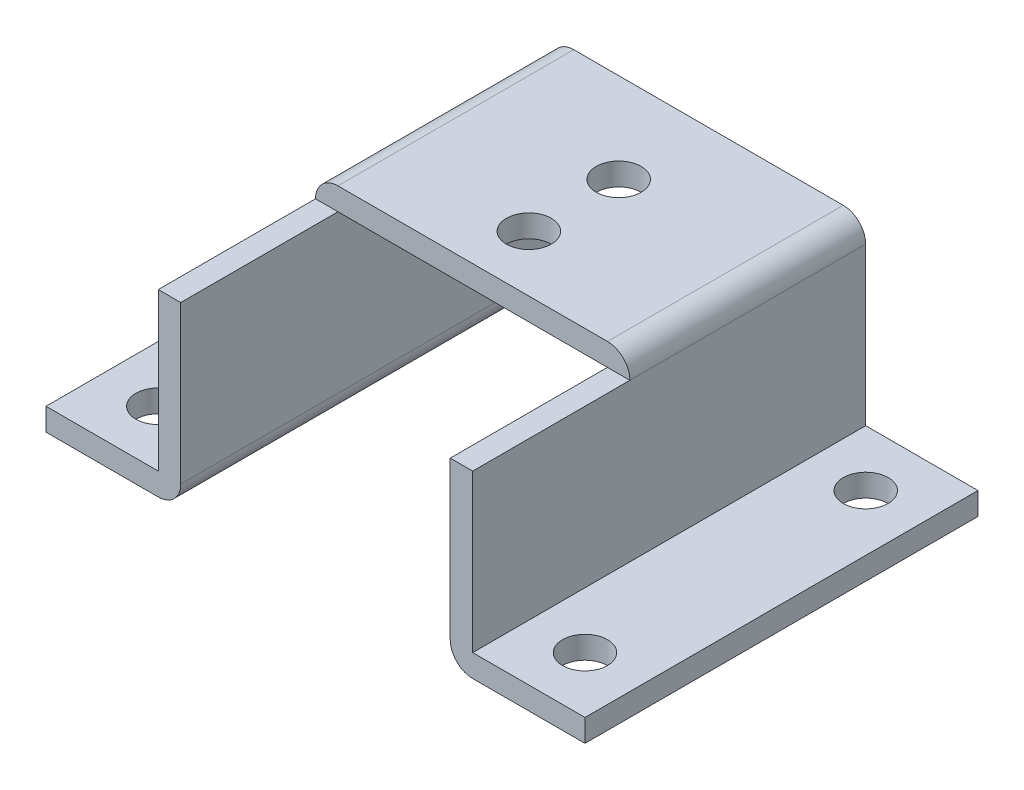
ISO-10303-21;
HEADER;
FILE_DESCRIPTION(('STEP AP214'),'2;1');
FILE_NAME('part.step','',(''),(''),'','','');
FILE_SCHEMA(('AUTOMOTIVE_DESIGN { 1 0 10303 214 1 1 1 1 }'));
ENDSEC;
DATA;
#1=APPLICATION_CONTEXT('core data for automotive mechanical design processes');
#2=APPLICATION_PROTOCOL_DEFINITION('international standard','automotive_design',2000,#1);
#3=PRODUCT_CONTEXT('',#1,'mechanical');
#4=PRODUCT('Part','Part','',(#3));
#5=PRODUCT_RELATED_PRODUCT_CATEGORY('part','',(#4));
#6=PRODUCT_DEFINITION_FORMATION('','',#4);
#7=PRODUCT_DEFINITION_CONTEXT('part definition',#1,'design');
#8=PRODUCT_DEFINITION('design','',#6,#7);
#9=PRODUCT_DEFINITION_SHAPE('','',#8);
#10=(LENGTH_UNIT() NAMED_UNIT(*) SI_UNIT(.MILLI.,.METRE.));
#11=(NAMED_UNIT(*) PLANE_ANGLE_UNIT() SI_UNIT($,.RADIAN.));
#12=(NAMED_UNIT(*) SI_UNIT($,.STERADIAN.) SOLID_ANGLE_UNIT());
#13=UNCERTAINTY_MEASURE_WITH_UNIT(LENGTH_MEASURE(1.E-05),#10,'distance_accuracy_value','');
#14=(GEOMETRIC_REPRESENTATION_CONTEXT(3) GLOBAL_UNCERTAINTY_ASSIGNED_CONTEXT((#13)) GLOBAL_UNIT_ASSIGNED_CONTEXT((#10,
#11,#12)) REPRESENTATION_CONTEXT('',''));
#15=CARTESIAN_POINT('',(0.,0.,0.));
#16=DIRECTION('',(0.,0.,1.));
#17=DIRECTION('',(1.,0.,0.));
#18=AXIS2_PLACEMENT_3D('',#15,#16,#17);
#19=CARTESIAN_POINT('',(12.,-12.8250209588798,-35.));
#20=DIRECTION('',(0.,-1.,0.));
#21=DIRECTION('',(0.,0.,-1.));
#22=AXIS2_PLACEMENT_3D('',#19,#20,#21);
#23=PLANE('',#22);
#24=CARTESIAN_POINT('',(19.,-12.8250209588798,-30.));
#25=DIRECTION('',(0.,1.,0.));
#26=DIRECTION('',(0.,0.,1.));
#27=AXIS2_PLACEMENT_3D('',#24,#25,#26);
#28=CIRCLE('',#27,1.99999999999999);
#29=CARTESIAN_POINT('',(19.,-12.8250209588798,-28.));
#30=VERTEX_POINT('',#29);
#31=EDGE_CURVE('E273',#30,#30,#28,.T.);
#32=ORIENTED_EDGE('',*,*,#31,.T.);
#33=EDGE_LOOP('',(#32));
#34=FACE_BOUND('',#33,.T.);
#35=DIRECTION('',(1.,0.,0.));
#36=VECTOR('',#35,1.);
#37=CARTESIAN_POINT('',(12.,-12.8250209588798,0.));
#38=LINE('',#37,#36);
#39=CARTESIAN_POINT('',(14.,-12.8250209588798,0.));
#40=VERTEX_POINT('',#39);
#41=CARTESIAN_POINT('',(24.,-12.8250209588798,0.));
#42=VERTEX_POINT('',#41);
#43=EDGE_CURVE('E311',#40,#42,#38,.T.);
#44=ORIENTED_EDGE('',*,*,#43,.F.);
#45=DIRECTION('',(0.,0.,1.));
#46=VECTOR('',#45,1.);
#47=CARTESIAN_POINT('',(14.,-12.8250209588798,-35.));
#48=LINE('',#47,#46);
#49=CARTESIAN_POINT('',(14.,-12.8250209588798,-35.));
#50=VERTEX_POINT('',#49);
#51=EDGE_CURVE('E228',#40,#50,#48,.F.);
#52=ORIENTED_EDGE('',*,*,#51,.T.);
#53=DIRECTION('',(1.,0.,0.));
#54=VECTOR('',#53,1.);
#55=CARTESIAN_POINT('',(12.,-12.8250209588798,-35.));
#56=LINE('',#55,#54);
#57=CARTESIAN_POINT('',(24.,-12.8250209588798,-35.));
#58=VERTEX_POINT('',#57);
#59=EDGE_CURVE('E346',#50,#58,#56,.T.);
#60=ORIENTED_EDGE('',*,*,#59,.T.);
#61=DIRECTION('',(0.,0.,1.));
#62=VECTOR('',#61,1.);
#63=CARTESIAN_POINT('',(24.,-12.8250209588798,-35.));
#64=LINE('',#63,#62);
#65=EDGE_CURVE('E383',#58,#42,#64,.T.);
#66=ORIENTED_EDGE('',*,*,#65,.T.);
#67=EDGE_LOOP('',(#44,#52,#60,#66));
#68=FACE_BOUND('',#67,.T.);
#69=CARTESIAN_POINT('',(19.,-12.8250209588798,-5.));
#70=DIRECTION('',(0.,1.,0.));
#71=DIRECTION('',(0.,0.,1.));
#72=AXIS2_PLACEMENT_3D('',#69,#70,#71);
#73=CIRCLE('',#72,1.99999999999999);
#74=CARTESIAN_POINT('',(19.,-12.8250209588798,-3.00000000000001));
#75=VERTEX_POINT('',#74);
#76=EDGE_CURVE('E281',#75,#75,#73,.T.);
#77=ORIENTED_EDGE('',*,*,#76,.T.);
#78=EDGE_LOOP('',(#77));
#79=FACE_BOUND('',#78,.T.);
#80=ADVANCED_FACE('F43',(#34,#68,#79),#23,.T.);
#81=CARTESIAN_POINT('',(0.,0.,0.));
#82=DIRECTION('',(0.,0.,1.));
#83=DIRECTION('',(1.,0.,0.));
#84=AXIS2_PLACEMENT_3D('',#81,#82,#83);
#85=PLANE('',#84);
#86=DIRECTION('',(0.,-1.,0.));
#87=VECTOR('',#86,1.);
#88=CARTESIAN_POINT('',(12.,3.17497904112024,0.));
#89=LINE('',#88,#87);
#90=CARTESIAN_POINT('',(12.,3.17497904112024,0.));
#91=VERTEX_POINT('',#90);
#92=CARTESIAN_POINT('',(12.,-10.8250209588798,0.));
#93=VERTEX_POINT('',#92);
#94=EDGE_CURVE('E377',#91,#93,#89,.T.);
#95=ORIENTED_EDGE('',*,*,#94,.T.);
#96=CARTESIAN_POINT('',(14.,-10.8250209588798,0.));
#97=DIRECTION('',(0.,0.,1.));
#98=DIRECTION('',(1.,0.,0.));
#99=AXIS2_PLACEMENT_3D('',#96,#97,#98);
#100=CIRCLE('',#99,2.);
#101=EDGE_CURVE('E225',#93,#40,#100,.T.);
#102=ORIENTED_EDGE('',*,*,#101,.T.);
#103=ORIENTED_EDGE('',*,*,#43,.T.);
#104=DIRECTION('',(0.,1.,0.));
#105=VECTOR('',#104,1.);
#106=CARTESIAN_POINT('',(24.,-10.8250209588798,0.));
#107=LINE('',#106,#105);
#108=CARTESIAN_POINT('',(24.,-10.8250209588798,0.));
#109=VERTEX_POINT('',#108);
#110=EDGE_CURVE('E305',#42,#109,#107,.T.);
#111=ORIENTED_EDGE('',*,*,#110,.T.);
#112=DIRECTION('',(-1.,0.,0.));
#113=VECTOR('',#112,1.);
#114=CARTESIAN_POINT('',(14.,-10.8250209588798,0.));
#115=LINE('',#114,#113);
#116=CARTESIAN_POINT('',(14.,-10.8250209588798,0.));
#117=VERTEX_POINT('',#116);
#118=EDGE_CURVE('E353',#109,#117,#115,.T.);
#119=ORIENTED_EDGE('',*,*,#118,.T.);
#120=DIRECTION('',(0.,1.,0.));
#121=VECTOR('',#120,1.);
#122=CARTESIAN_POINT('',(14.,5.17497904112024,0.));
#123=LINE('',#122,#121);
#124=CARTESIAN_POINT('',(14.,3.17497904112024,0.));
#125=VERTEX_POINT('',#124);
#126=EDGE_CURVE('E357',#117,#125,#123,.T.);
#127=ORIENTED_EDGE('',*,*,#126,.T.);
#128=DIRECTION('',(1.,0.,0.));
#129=VECTOR('',#128,1.);
#130=CARTESIAN_POINT('',(-14.,3.17497904112024,0.));
#131=LINE('',#130,#129);
#132=EDGE_CURVE('E180',#91,#125,#131,.T.);
#133=ORIENTED_EDGE('',*,*,#132,.F.);
#134=EDGE_LOOP('',(#95,#102,#103,#111,#119,#127,#133));
#135=FACE_BOUND('',#134,.T.);
#136=ADVANCED_FACE('F456',(#135),#85,.T.);
#137=DIRECTION('',(1.,0.,0.));
#138=VECTOR('',#137,1.);
#139=CARTESIAN_POINT('',(-24.,-12.8250209588798,0.));
#140=LINE('',#139,#138);
#141=CARTESIAN_POINT('',(-24.,-12.8250209588798,0.));
#142=VERTEX_POINT('',#141);
#143=CARTESIAN_POINT('',(-14.,-12.8250209588798,0.));
#144=VERTEX_POINT('',#143);
#145=EDGE_CURVE('E371',#142,#144,#140,.T.);
#146=ORIENTED_EDGE('',*,*,#145,.T.);
#147=CARTESIAN_POINT('',(-14.,-10.8250209588798,0.));
#148=DIRECTION('',(0.,0.,1.));
#149=DIRECTION('',(1.,0.,0.));
#150=AXIS2_PLACEMENT_3D('',#147,#148,#149);
#151=CIRCLE('',#150,2.);
#152=CARTESIAN_POINT('',(-12.,-10.8250209588798,0.));
#153=VERTEX_POINT('',#152);
#154=EDGE_CURVE('E68',#144,#153,#151,.T.);
#155=ORIENTED_EDGE('',*,*,#154,.T.);
#156=DIRECTION('',(0.,1.,0.));
#157=VECTOR('',#156,1.);
#158=CARTESIAN_POINT('',(-12.,3.17497904112024,0.));
#159=LINE('',#158,#157);
#160=CARTESIAN_POINT('',(-12.,3.17497904112024,0.));
#161=VERTEX_POINT('',#160);
#162=EDGE_CURVE('E374',#153,#161,#159,.T.);
#163=ORIENTED_EDGE('',*,*,#162,.T.);
#164=CARTESIAN_POINT('',(-14.,3.17497904112024,0.));
#165=VERTEX_POINT('',#164);
#166=EDGE_CURVE('E289',#165,#161,#131,.T.);
#167=ORIENTED_EDGE('',*,*,#166,.F.);
#168=DIRECTION('',(0.,-1.,0.));
#169=VECTOR('',#168,1.);
#170=CARTESIAN_POINT('',(-14.,5.17497904112024,0.));
#171=LINE('',#170,#169);
#172=CARTESIAN_POINT('',(-14.,-10.8250209588798,0.));
#173=VERTEX_POINT('',#172);
#174=EDGE_CURVE('E360',#165,#173,#171,.T.);
#175=ORIENTED_EDGE('',*,*,#174,.T.);
#176=DIRECTION('',(-1.,0.,0.));
#177=VECTOR('',#176,1.);
#178=CARTESIAN_POINT('',(-24.,-10.8250209588798,0.));
#179=LINE('',#178,#177);
#180=CARTESIAN_POINT('',(-24.,-10.8250209588798,0.));
#181=VERTEX_POINT('',#180);
#182=EDGE_CURVE('E363',#173,#181,#179,.T.);
#183=ORIENTED_EDGE('',*,*,#182,.T.);
#184=DIRECTION('',(0.,-1.,0.));
#185=VECTOR('',#184,1.);
#186=CARTESIAN_POINT('',(-24.,-10.8250209588798,0.));
#187=LINE('',#186,#185);
#188=EDGE_CURVE('E367',#181,#142,#187,.T.);
#189=ORIENTED_EDGE('',*,*,#188,.T.);
#190=EDGE_LOOP('',(#146,#155,#163,#167,#175,#183,#189));
#191=FACE_BOUND('',#190,.T.);
#192=ADVANCED_FACE('F477',(#191),#85,.T.);
#193=CARTESIAN_POINT('',(24.,-10.8250209588798,-35.));
#194=DIRECTION('',(1.,0.,0.));
#195=DIRECTION('',(0.,0.,-1.));
#196=AXIS2_PLACEMENT_3D('',#193,#194,#195);
#197=PLANE('',#196);
#198=ORIENTED_EDGE('',*,*,#110,.F.);
#199=ORIENTED_EDGE('',*,*,#65,.F.);
#200=DIRECTION('',(0.,1.,0.));
#201=VECTOR('',#200,1.);
#202=CARTESIAN_POINT('',(24.,-10.8250209588798,-35.));
#203=LINE('',#202,#201);
#204=CARTESIAN_POINT('',(24.,-10.8250209588798,-35.));
#205=VERTEX_POINT('',#204);
#206=EDGE_CURVE('E306',#58,#205,#203,.T.);
#207=ORIENTED_EDGE('',*,*,#206,.T.);
#208=DIRECTION('',(0.,0.,1.));
#209=VECTOR('',#208,1.);
#210=CARTESIAN_POINT('',(24.,-10.8250209588798,-35.));
#211=LINE('',#210,#209);
#212=EDGE_CURVE('E349',#205,#109,#211,.T.);
#213=ORIENTED_EDGE('',*,*,#212,.T.);
#214=EDGE_LOOP('',(#198,#199,#207,#213));
#215=FACE_BOUND('',#214,.T.);
#216=ADVANCED_FACE('F442',(#215),#197,.T.);
#217=CARTESIAN_POINT('',(12.,3.17497904112024,-35.));
#218=DIRECTION('',(-1.,0.,0.));
#219=DIRECTION('',(0.,0.,1.));
#220=AXIS2_PLACEMENT_3D('',#217,#218,#219);
#221=PLANE('',#220);
#222=DIRECTION('',(0.,-1.,0.));
#223=VECTOR('',#222,1.);
#224=CARTESIAN_POINT('',(12.,3.17497904112024,-35.));
#225=LINE('',#224,#223);
#226=CARTESIAN_POINT('',(12.,3.17497904112024,-35.));
#227=VERTEX_POINT('',#226);
#228=CARTESIAN_POINT('',(12.,-10.8250209588798,-35.));
#229=VERTEX_POINT('',#228);
#230=EDGE_CURVE('E342',#227,#229,#225,.T.);
#231=ORIENTED_EDGE('',*,*,#230,.T.);
#232=DIRECTION('',(0.,0.,1.));
#233=VECTOR('',#232,1.);
#234=CARTESIAN_POINT('',(12.,-10.8250209588798,-35.));
#235=LINE('',#234,#233);
#236=EDGE_CURVE('E202',#229,#93,#235,.T.);
#237=ORIENTED_EDGE('',*,*,#236,.T.);
#238=ORIENTED_EDGE('',*,*,#94,.F.);
#239=DIRECTION('',(0.,0.,-1.));
#240=VECTOR('',#239,1.);
#241=CARTESIAN_POINT('',(12.,3.17497904112024,-35.));
#242=LINE('',#241,#240);
#243=CARTESIAN_POINT('',(12.,3.17497904112024,-14.));
#244=VERTEX_POINT('',#243);
#245=EDGE_CURVE('E299',#91,#244,#242,.T.);
#246=ORIENTED_EDGE('',*,*,#245,.T.);
#247=DIRECTION('',(0.,0.,1.));
#248=VECTOR('',#247,1.);
#249=CARTESIAN_POINT('',(12.,3.17497904112024,-35.));
#250=LINE('',#249,#248);
#251=EDGE_CURVE('E388',#227,#244,#250,.T.);
#252=ORIENTED_EDGE('',*,*,#251,.F.);
#253=EDGE_LOOP('',(#231,#237,#238,#246,#252));
#254=FACE_BOUND('',#253,.T.);
#255=ADVANCED_FACE('F454',(#254),#221,.T.);
#256=CARTESIAN_POINT('',(-12.,3.17497904112024,-35.));
#257=DIRECTION('',(0.,-1.,0.));
#258=DIRECTION('',(0.,0.,-1.));
#259=AXIS2_PLACEMENT_3D('',#256,#257,#258);
#260=PLANE('',#259);
#261=CARTESIAN_POINT('',(0.,3.17497904112024,-27.));
#262=DIRECTION('',(0.,-1.,0.));
#263=DIRECTION('',(0.,0.,-1.));
#264=AXIS2_PLACEMENT_3D('',#261,#262,#263);
#265=CIRCLE('',#264,2.);
#266=CARTESIAN_POINT('',(0.,3.17497904112024,-29.));
#267=VERTEX_POINT('',#266);
#268=EDGE_CURVE('E251',#267,#267,#265,.T.);
#269=ORIENTED_EDGE('',*,*,#268,.F.);
#270=EDGE_LOOP('',(#269));
#271=FACE_BOUND('',#270,.T.);
#272=CARTESIAN_POINT('',(0.,3.17497904112024,-19.));
#273=DIRECTION('',(0.,-1.,0.));
#274=DIRECTION('',(0.,0.,-1.));
#275=AXIS2_PLACEMENT_3D('',#272,#273,#274);
#276=CIRCLE('',#275,2.);
#277=CARTESIAN_POINT('',(0.,3.17497904112024,-21.));
#278=VERTEX_POINT('',#277);
#279=EDGE_CURVE('E269',#278,#278,#276,.T.);
#280=ORIENTED_EDGE('',*,*,#279,.F.);
#281=EDGE_LOOP('',(#280));
#282=FACE_BOUND('',#281,.T.);
#283=DIRECTION('',(-1.,0.,0.));
#284=VECTOR('',#283,1.);
#285=CARTESIAN_POINT('',(-14.,3.17497904112024,-14.));
#286=LINE('',#285,#284);
#287=CARTESIAN_POINT('',(-12.,3.17497904112024,-14.));
#288=VERTEX_POINT('',#287);
#289=EDGE_CURVE('E176',#244,#288,#286,.T.);
#290=ORIENTED_EDGE('',*,*,#289,.T.);
#291=DIRECTION('',(0.,0.,1.));
#292=VECTOR('',#291,1.);
#293=CARTESIAN_POINT('',(-12.,3.17497904112024,-35.));
#294=LINE('',#293,#292);
#295=CARTESIAN_POINT('',(-12.,3.17497904112024,-35.));
#296=VERTEX_POINT('',#295);
#297=EDGE_CURVE('E392',#296,#288,#294,.T.);
#298=ORIENTED_EDGE('',*,*,#297,.F.);
#299=DIRECTION('',(1.,0.,0.));
#300=VECTOR('',#299,1.);
#301=CARTESIAN_POINT('',(-12.,3.17497904112024,-35.));
#302=LINE('',#301,#300);
#303=EDGE_CURVE('E338',#296,#227,#302,.T.);
#304=ORIENTED_EDGE('',*,*,#303,.T.);
#305=ORIENTED_EDGE('',*,*,#251,.T.);
#306=EDGE_LOOP('',(#290,#298,#304,#305));
#307=FACE_BOUND('',#306,.T.);
#308=ADVANCED_FACE('F467',(#271,#282,#307),#260,.T.);
#309=CARTESIAN_POINT('',(-12.,3.17497904112024,-35.));
#310=DIRECTION('',(1.,0.,0.));
#311=DIRECTION('',(0.,0.,-1.));
#312=AXIS2_PLACEMENT_3D('',#309,#310,#311);
#313=PLANE('',#312);
#314=ORIENTED_EDGE('',*,*,#162,.F.);
#315=DIRECTION('',(0.,0.,1.));
#316=VECTOR('',#315,1.);
#317=CARTESIAN_POINT('',(-12.,-10.8250209588798,-35.));
#318=LINE('',#317,#316);
#319=CARTESIAN_POINT('',(-12.,-10.8250209588798,-35.));
#320=VERTEX_POINT('',#319);
#321=EDGE_CURVE('E53',#153,#320,#318,.F.);
#322=ORIENTED_EDGE('',*,*,#321,.T.);
#323=DIRECTION('',(0.,1.,0.));
#324=VECTOR('',#323,1.);
#325=CARTESIAN_POINT('',(-12.,3.17497904112024,-35.));
#326=LINE('',#325,#324);
#327=EDGE_CURVE('E335',#320,#296,#326,.T.);
#328=ORIENTED_EDGE('',*,*,#327,.T.);
#329=ORIENTED_EDGE('',*,*,#297,.T.);
#330=DIRECTION('',(0.,0.,1.));
#331=VECTOR('',#330,1.);
#332=CARTESIAN_POINT('',(-12.,3.17497904112024,-35.));
#333=LINE('',#332,#331);
#334=EDGE_CURVE('E293',#288,#161,#333,.T.);
#335=ORIENTED_EDGE('',*,*,#334,.T.);
#336=EDGE_LOOP('',(#314,#322,#328,#329,#335));
#337=FACE_BOUND('',#336,.T.);
#338=ADVANCED_FACE('F469',(#337),#313,.T.);
#339=CARTESIAN_POINT('',(-24.,-12.8250209588798,-35.));
#340=DIRECTION('',(0.,-1.,0.));
#341=DIRECTION('',(0.,0.,-1.));
#342=AXIS2_PLACEMENT_3D('',#339,#340,#341);
#343=PLANE('',#342);
#344=CARTESIAN_POINT('',(-19.,-12.8250209588798,-30.));
#345=DIRECTION('',(0.,1.,0.));
#346=DIRECTION('',(0.,0.,1.));
#347=AXIS2_PLACEMENT_3D('',#344,#345,#346);
#348=CIRCLE('',#347,1.99999999999999);
#349=CARTESIAN_POINT('',(-19.,-12.8250209588798,-28.));
#350=VERTEX_POINT('',#349);
#351=EDGE_CURVE('E259',#350,#350,#348,.T.);
#352=ORIENTED_EDGE('',*,*,#351,.T.);
#353=EDGE_LOOP('',(#352));
#354=FACE_BOUND('',#353,.T.);
#355=CARTESIAN_POINT('',(-19.,-12.8250209588798,-5.));
#356=DIRECTION('',(0.,1.,0.));
#357=DIRECTION('',(0.,0.,1.));
#358=AXIS2_PLACEMENT_3D('',#355,#356,#357);
#359=CIRCLE('',#358,1.99999999999999);
#360=CARTESIAN_POINT('',(-19.,-12.8250209588798,-3.00000000000001));
#361=VERTEX_POINT('',#360);
#362=EDGE_CURVE('E245',#361,#361,#359,.T.);
#363=ORIENTED_EDGE('',*,*,#362,.T.);
#364=EDGE_LOOP('',(#363));
#365=FACE_BOUND('',#364,.T.);
#366=DIRECTION('',(1.,0.,0.));
#367=VECTOR('',#366,1.);
#368=CARTESIAN_POINT('',(-24.,-12.8250209588798,-35.));
#369=LINE('',#368,#367);
#370=CARTESIAN_POINT('',(-24.,-12.8250209588798,-35.));
#371=VERTEX_POINT('',#370);
#372=CARTESIAN_POINT('',(-14.,-12.8250209588798,-35.));
#373=VERTEX_POINT('',#372);
#374=EDGE_CURVE('E331',#371,#373,#369,.T.);
#375=ORIENTED_EDGE('',*,*,#374,.T.);
#376=DIRECTION('',(0.,0.,1.));
#377=VECTOR('',#376,1.);
#378=CARTESIAN_POINT('',(-14.,-12.8250209588798,-35.));
#379=LINE('',#378,#377);
#380=EDGE_CURVE('E234',#373,#144,#379,.T.);
#381=ORIENTED_EDGE('',*,*,#380,.T.);
#382=ORIENTED_EDGE('',*,*,#145,.F.);
#383=DIRECTION('',(0.,0.,1.));
#384=VECTOR('',#383,1.);
#385=CARTESIAN_POINT('',(-24.,-12.8250209588798,-35.));
#386=LINE('',#385,#384);
#387=EDGE_CURVE('E396',#371,#142,#386,.T.);
#388=ORIENTED_EDGE('',*,*,#387,.F.);
#389=EDGE_LOOP('',(#375,#381,#382,#388));
#390=FACE_BOUND('',#389,.T.);
#391=ADVANCED_FACE('F476',(#354,#365,#390),#343,.T.);
#392=CARTESIAN_POINT('',(-24.,-10.8250209588798,-35.));
#393=DIRECTION('',(-1.,0.,0.));
#394=DIRECTION('',(0.,0.,1.));
#395=AXIS2_PLACEMENT_3D('',#392,#393,#394);
#396=PLANE('',#395);
#397=ORIENTED_EDGE('',*,*,#188,.F.);
#398=DIRECTION('',(0.,0.,1.));
#399=VECTOR('',#398,1.);
#400=CARTESIAN_POINT('',(-24.,-10.8250209588798,-35.));
#401=LINE('',#400,#399);
#402=CARTESIAN_POINT('',(-24.,-10.8250209588798,-35.));
#403=VERTEX_POINT('',#402);
#404=EDGE_CURVE('E399',#403,#181,#401,.T.);
#405=ORIENTED_EDGE('',*,*,#404,.F.);
#406=DIRECTION('',(0.,-1.,0.));
#407=VECTOR('',#406,1.);
#408=CARTESIAN_POINT('',(-24.,-10.8250209588798,-35.));
#409=LINE('',#408,#407);
#410=EDGE_CURVE('E327',#403,#371,#409,.T.);
#411=ORIENTED_EDGE('',*,*,#410,.T.);
#412=ORIENTED_EDGE('',*,*,#387,.T.);
#413=EDGE_LOOP('',(#397,#405,#411,#412));
#414=FACE_BOUND('',#413,.T.);
#415=ADVANCED_FACE('F481',(#414),#396,.T.);
#416=CARTESIAN_POINT('',(-24.,-10.8250209588798,-35.));
#417=DIRECTION('',(0.,1.,0.));
#418=DIRECTION('',(-1.,0.,0.));
#419=AXIS2_PLACEMENT_3D('',#416,#417,#418);
#420=PLANE('',#419);
#421=CARTESIAN_POINT('',(-19.,-10.8250209588798,-30.));
#422=DIRECTION('',(0.,1.,0.));
#423=DIRECTION('',(-1.,0.,0.));
#424=AXIS2_PLACEMENT_3D('',#421,#422,#423);
#425=CIRCLE('',#424,2.);
#426=CARTESIAN_POINT('',(-21.,-10.8250209588798,-30.));
#427=VERTEX_POINT('',#426);
#428=EDGE_CURVE('E47',#427,#427,#425,.T.);
#429=ORIENTED_EDGE('',*,*,#428,.F.);
#430=EDGE_LOOP('',(#429));
#431=FACE_BOUND('',#430,.T.);
#432=CARTESIAN_POINT('',(-19.,-10.8250209588798,-5.));
#433=DIRECTION('',(0.,1.,0.));
#434=DIRECTION('',(-1.,0.,0.));
#435=AXIS2_PLACEMENT_3D('',#432,#433,#434);
#436=CIRCLE('',#435,2.);
#437=CARTESIAN_POINT('',(-21.,-10.8250209588798,-5.));
#438=VERTEX_POINT('',#437);
#439=EDGE_CURVE('E241',#438,#438,#436,.T.);
#440=ORIENTED_EDGE('',*,*,#439,.F.);
#441=EDGE_LOOP('',(#440));
#442=FACE_BOUND('',#441,.T.);
#443=ORIENTED_EDGE('',*,*,#182,.F.);
#444=DIRECTION('',(0.,0.,1.));
#445=VECTOR('',#444,1.);
#446=CARTESIAN_POINT('',(-14.,-10.8250209588798,-35.));
#447=LINE('',#446,#445);
#448=CARTESIAN_POINT('',(-14.,-10.8250209588798,-35.));
#449=VERTEX_POINT('',#448);
#450=EDGE_CURVE('E402',#449,#173,#447,.T.);
#451=ORIENTED_EDGE('',*,*,#450,.F.);
#452=DIRECTION('',(-1.,0.,0.));
#453=VECTOR('',#452,1.);
#454=CARTESIAN_POINT('',(-24.,-10.8250209588798,-35.));
#455=LINE('',#454,#453);
#456=EDGE_CURVE('E323',#449,#403,#455,.T.);
#457=ORIENTED_EDGE('',*,*,#456,.T.);
#458=ORIENTED_EDGE('',*,*,#404,.T.);
#459=EDGE_LOOP('',(#443,#451,#457,#458));
#460=FACE_BOUND('',#459,.T.);
#461=ADVANCED_FACE('F483',(#431,#442,#460),#420,.T.);
#462=CARTESIAN_POINT('',(-14.,5.17497904112024,-35.));
#463=DIRECTION('',(-1.,0.,0.));
#464=DIRECTION('',(0.,0.,1.));
#465=AXIS2_PLACEMENT_3D('',#462,#463,#464);
#466=PLANE('',#465);
#467=ORIENTED_EDGE('',*,*,#174,.F.);
#468=DIRECTION('',(0.,0.,1.));
#469=VECTOR('',#468,1.);
#470=CARTESIAN_POINT('',(-14.,3.17497904112024,-35.));
#471=LINE('',#470,#469);
#472=CARTESIAN_POINT('',(-14.,3.17497904112024,-14.));
#473=VERTEX_POINT('',#472);
#474=EDGE_CURVE('E216',#165,#473,#471,.F.);
#475=ORIENTED_EDGE('',*,*,#474,.T.);
#476=CARTESIAN_POINT('',(-14.,3.17497904112024,-35.));
#477=VERTEX_POINT('',#476);
#478=EDGE_CURVE('E413',#473,#477,#471,.F.);
#479=ORIENTED_EDGE('',*,*,#478,.T.);
#480=DIRECTION('',(0.,-1.,0.));
#481=VECTOR('',#480,1.);
#482=CARTESIAN_POINT('',(-14.,5.17497904112024,-35.));
#483=LINE('',#482,#481);
#484=EDGE_CURVE('E320',#477,#449,#483,.T.);
#485=ORIENTED_EDGE('',*,*,#484,.T.);
#486=ORIENTED_EDGE('',*,*,#450,.T.);
#487=EDGE_LOOP('',(#467,#475,#479,#485,#486));
#488=FACE_BOUND('',#487,.T.);
#489=ADVANCED_FACE('F421',(#488),#466,.T.);
#490=CARTESIAN_POINT('',(-14.,5.17497904112024,-35.));
#491=DIRECTION('',(0.,1.,0.));
#492=DIRECTION('',(0.,0.,1.));
#493=AXIS2_PLACEMENT_3D('',#490,#491,#492);
#494=PLANE('',#493);
#495=CARTESIAN_POINT('',(0.,5.17497904112024,-27.));
#496=DIRECTION('',(0.,1.,0.));
#497=DIRECTION('',(0.,0.,1.));
#498=AXIS2_PLACEMENT_3D('',#495,#496,#497);
#499=CIRCLE('',#498,2.);
#500=CARTESIAN_POINT('',(0.,5.17497904112024,-25.));
#501=VERTEX_POINT('',#500);
#502=EDGE_CURVE('E244',#501,#501,#499,.T.);
#503=ORIENTED_EDGE('',*,*,#502,.F.);
#504=EDGE_LOOP('',(#503));
#505=FACE_BOUND('',#504,.T.);
#506=CARTESIAN_POINT('',(0.,5.17497904112024,-19.));
#507=DIRECTION('',(0.,1.,0.));
#508=DIRECTION('',(0.,0.,1.));
#509=AXIS2_PLACEMENT_3D('',#506,#507,#508);
#510=CIRCLE('',#509,2.);
#511=CARTESIAN_POINT('',(0.,5.17497904112024,-17.));
#512=VERTEX_POINT('',#511);
#513=EDGE_CURVE('E265',#512,#512,#510,.T.);
#514=ORIENTED_EDGE('',*,*,#513,.F.);
#515=EDGE_LOOP('',(#514));
#516=FACE_BOUND('',#515,.T.);
#517=DIRECTION('',(-1.,0.,0.));
#518=VECTOR('',#517,1.);
#519=CARTESIAN_POINT('',(-14.,5.17497904112024,-14.));
#520=LINE('',#519,#518);
#521=CARTESIAN_POINT('',(12.,5.17497904112024,-14.));
#522=VERTEX_POINT('',#521);
#523=CARTESIAN_POINT('',(-12.,5.17497904112024,-14.));
#524=VERTEX_POINT('',#523);
#525=EDGE_CURVE('E192',#522,#524,#520,.T.);
#526=ORIENTED_EDGE('',*,*,#525,.F.);
#527=DIRECTION('',(0.,0.,1.));
#528=VECTOR('',#527,1.);
#529=CARTESIAN_POINT('',(12.,5.17497904112024,-35.));
#530=LINE('',#529,#528);
#531=CARTESIAN_POINT('',(12.,5.17497904112024,-35.));
#532=VERTEX_POINT('',#531);
#533=EDGE_CURVE('E200',#522,#532,#530,.F.);
#534=ORIENTED_EDGE('',*,*,#533,.T.);
#535=DIRECTION('',(-1.,0.,0.));
#536=VECTOR('',#535,1.);
#537=CARTESIAN_POINT('',(-14.,5.17497904112024,-35.));
#538=LINE('',#537,#536);
#539=CARTESIAN_POINT('',(-12.,5.17497904112024,-35.));
#540=VERTEX_POINT('',#539);
#541=EDGE_CURVE('E317',#532,#540,#538,.T.);
#542=ORIENTED_EDGE('',*,*,#541,.T.);
#543=DIRECTION('',(0.,0.,1.));
#544=VECTOR('',#543,1.);
#545=CARTESIAN_POINT('',(-12.,5.17497904112024,-35.));
#546=LINE('',#545,#544);
#547=EDGE_CURVE('E387',#540,#524,#546,.T.);
#548=ORIENTED_EDGE('',*,*,#547,.T.);
#549=EDGE_LOOP('',(#526,#534,#542,#548));
#550=FACE_BOUND('',#549,.T.);
#551=ADVANCED_FACE('F434',(#505,#516,#550),#494,.T.);
#552=CARTESIAN_POINT('',(14.,5.17497904112024,-35.));
#553=DIRECTION('',(1.,0.,0.));
#554=DIRECTION('',(0.,0.,-1.));
#555=AXIS2_PLACEMENT_3D('',#552,#553,#554);
#556=PLANE('',#555);
#557=DIRECTION('',(0.,1.,0.));
#558=VECTOR('',#557,1.);
#559=CARTESIAN_POINT('',(14.,5.17497904112024,-35.));
#560=LINE('',#559,#558);
#561=CARTESIAN_POINT('',(14.,-10.8250209588798,-35.));
#562=VERTEX_POINT('',#561);
#563=CARTESIAN_POINT('',(14.,3.17497904112024,-35.));
#564=VERTEX_POINT('',#563);
#565=EDGE_CURVE('E208',#562,#564,#560,.T.);
#566=ORIENTED_EDGE('',*,*,#565,.T.);
#567=DIRECTION('',(0.,0.,1.));
#568=VECTOR('',#567,1.);
#569=CARTESIAN_POINT('',(14.,3.17497904112024,-35.));
#570=LINE('',#569,#568);
#571=CARTESIAN_POINT('',(14.,3.17497904112024,-14.));
#572=VERTEX_POINT('',#571);
#573=EDGE_CURVE('E199',#564,#572,#570,.T.);
#574=ORIENTED_EDGE('',*,*,#573,.T.);
#575=DIRECTION('',(0.,0.,-1.));
#576=VECTOR('',#575,1.);
#577=CARTESIAN_POINT('',(14.,3.17497904112024,-14.));
#578=LINE('',#577,#576);
#579=EDGE_CURVE('E184',#125,#572,#578,.T.);
#580=ORIENTED_EDGE('',*,*,#579,.F.);
#581=ORIENTED_EDGE('',*,*,#126,.F.);
#582=DIRECTION('',(0.,0.,1.));
#583=VECTOR('',#582,1.);
#584=CARTESIAN_POINT('',(14.,-10.8250209588798,-35.));
#585=LINE('',#584,#583);
#586=EDGE_CURVE('E406',#562,#117,#585,.T.);
#587=ORIENTED_EDGE('',*,*,#586,.F.);
#588=EDGE_LOOP('',(#566,#574,#580,#581,#587));
#589=FACE_BOUND('',#588,.T.);
#590=ADVANCED_FACE('F206',(#589),#556,.T.);
#591=CARTESIAN_POINT('',(14.,-10.8250209588798,-35.));
#592=DIRECTION('',(0.,1.,0.));
#593=DIRECTION('',(0.,0.,1.));
#594=AXIS2_PLACEMENT_3D('',#591,#592,#593);
#595=PLANE('',#594);
#596=CARTESIAN_POINT('',(19.,-10.8250209588798,-30.));
#597=DIRECTION('',(0.,1.,0.));
#598=DIRECTION('',(0.,0.,1.));
#599=AXIS2_PLACEMENT_3D('',#596,#597,#598);
#600=CIRCLE('',#599,2.);
#601=CARTESIAN_POINT('',(19.,-10.8250209588798,-28.));
#602=VERTEX_POINT('',#601);
#603=EDGE_CURVE('E277',#602,#602,#600,.T.);
#604=ORIENTED_EDGE('',*,*,#603,.F.);
#605=EDGE_LOOP('',(#604));
#606=FACE_BOUND('',#605,.T.);
#607=CARTESIAN_POINT('',(19.,-10.8250209588798,-5.));
#608=DIRECTION('',(0.,1.,0.));
#609=DIRECTION('',(0.,0.,1.));
#610=AXIS2_PLACEMENT_3D('',#607,#608,#609);
#611=CIRCLE('',#610,2.);
#612=CARTESIAN_POINT('',(19.,-10.8250209588798,-3.));
#613=VERTEX_POINT('',#612);
#614=EDGE_CURVE('E285',#613,#613,#611,.T.);
#615=ORIENTED_EDGE('',*,*,#614,.F.);
#616=EDGE_LOOP('',(#615));
#617=FACE_BOUND('',#616,.T.);
#618=ORIENTED_EDGE('',*,*,#118,.F.);
#619=ORIENTED_EDGE('',*,*,#212,.F.);
#620=DIRECTION('',(-1.,0.,0.));
#621=VECTOR('',#620,1.);
#622=CARTESIAN_POINT('',(14.,-10.8250209588798,-35.));
#623=LINE('',#622,#621);
#624=EDGE_CURVE('E310',#205,#562,#623,.T.);
#625=ORIENTED_EDGE('',*,*,#624,.T.);
#626=ORIENTED_EDGE('',*,*,#586,.T.);
#627=EDGE_LOOP('',(#618,#619,#625,#626));
#628=FACE_BOUND('',#627,.T.);
#629=ADVANCED_FACE('F439',(#606,#617,#628),#595,.T.);
#630=CARTESIAN_POINT('',(0.,0.,-35.));
#631=DIRECTION('',(0.,0.,1.));
#632=DIRECTION('',(1.,0.,0.));
#633=AXIS2_PLACEMENT_3D('',#630,#631,#632);
#634=PLANE('',#633);
#635=ORIENTED_EDGE('',*,*,#327,.F.);
#636=CARTESIAN_POINT('',(-14.,-10.8250209588798,-35.));
#637=DIRECTION('',(0.,0.,1.));
#638=DIRECTION('',(1.,0.,0.));
#639=AXIS2_PLACEMENT_3D('',#636,#637,#638);
#640=CIRCLE('',#639,2.);
#641=EDGE_CURVE('E11',#320,#373,#640,.F.);
#642=ORIENTED_EDGE('',*,*,#641,.T.);
#643=ORIENTED_EDGE('',*,*,#374,.F.);
#644=ORIENTED_EDGE('',*,*,#410,.F.);
#645=ORIENTED_EDGE('',*,*,#456,.F.);
#646=ORIENTED_EDGE('',*,*,#484,.F.);
#647=CARTESIAN_POINT('',(-12.,3.17497904112024,-35.));
#648=DIRECTION('',(0.,0.,1.));
#649=DIRECTION('',(1.,0.,0.));
#650=AXIS2_PLACEMENT_3D('',#647,#648,#649);
#651=CIRCLE('',#650,2.);
#652=EDGE_CURVE('E210',#477,#540,#651,.F.);
#653=ORIENTED_EDGE('',*,*,#652,.T.);
#654=ORIENTED_EDGE('',*,*,#541,.F.);
#655=CARTESIAN_POINT('',(12.,3.17497904112024,-35.));
#656=DIRECTION('',(0.,0.,1.));
#657=DIRECTION('',(1.,0.,0.));
#658=AXIS2_PLACEMENT_3D('',#655,#656,#657);
#659=CIRCLE('',#658,2.);
#660=EDGE_CURVE('E203',#532,#564,#659,.F.);
#661=ORIENTED_EDGE('',*,*,#660,.T.);
#662=ORIENTED_EDGE('',*,*,#565,.F.);
#663=ORIENTED_EDGE('',*,*,#624,.F.);
#664=ORIENTED_EDGE('',*,*,#206,.F.);
#665=ORIENTED_EDGE('',*,*,#59,.F.);
#666=CARTESIAN_POINT('',(14.,-10.8250209588798,-35.));
#667=DIRECTION('',(0.,0.,1.));
#668=DIRECTION('',(1.,0.,0.));
#669=AXIS2_PLACEMENT_3D('',#666,#667,#668);
#670=CIRCLE('',#669,2.);
#671=EDGE_CURVE('E231',#50,#229,#670,.F.);
#672=ORIENTED_EDGE('',*,*,#671,.T.);
#673=ORIENTED_EDGE('',*,*,#230,.F.);
#674=ORIENTED_EDGE('',*,*,#303,.F.);
#675=EDGE_LOOP('',(#635,#642,#643,#644,#645,#646,#653,#654,#661,#662,#663,#664,#665,#672,#673,#674));
#676=FACE_BOUND('',#675,.T.);
#677=ADVANCED_FACE('F428',(#676),#634,.F.);
#678=CARTESIAN_POINT('',(-12.,3.17497904112024,-35.));
#679=DIRECTION('',(0.,0.,1.));
#680=DIRECTION('',(1.,0.,0.));
#681=AXIS2_PLACEMENT_3D('',#678,#679,#680);
#682=CYLINDRICAL_SURFACE('',#681,2.);
#683=CARTESIAN_POINT('',(-12.,3.17497904112024,-14.));
#684=DIRECTION('',(0.,0.,-1.));
#685=DIRECTION('',(-1.,0.,0.));
#686=AXIS2_PLACEMENT_3D('',#683,#684,#685);
#687=CIRCLE('',#686,2.);
#688=EDGE_CURVE('E302',#524,#473,#687,.F.);
#689=ORIENTED_EDGE('',*,*,#688,.F.);
#690=ORIENTED_EDGE('',*,*,#547,.F.);
#691=ORIENTED_EDGE('',*,*,#652,.F.);
#692=ORIENTED_EDGE('',*,*,#478,.F.);
#693=EDGE_LOOP('',(#689,#690,#691,#692));
#694=FACE_BOUND('',#693,.T.);
#695=ADVANCED_FACE('F432',(#694),#682,.T.);
#696=CARTESIAN_POINT('',(12.,3.17497904112024,-35.));
#697=DIRECTION('',(0.,0.,1.));
#698=DIRECTION('',(1.,0.,0.));
#699=AXIS2_PLACEMENT_3D('',#696,#697,#698);
#700=CYLINDRICAL_SURFACE('',#699,2.);
#701=CARTESIAN_POINT('',(12.,3.17497904112024,-14.));
#702=DIRECTION('',(0.,0.,-1.));
#703=DIRECTION('',(-1.,0.,0.));
#704=AXIS2_PLACEMENT_3D('',#701,#702,#703);
#705=CIRCLE('',#704,2.);
#706=EDGE_CURVE('E172',#572,#522,#705,.F.);
#707=ORIENTED_EDGE('',*,*,#706,.F.);
#708=ORIENTED_EDGE('',*,*,#573,.F.);
#709=ORIENTED_EDGE('',*,*,#660,.F.);
#710=ORIENTED_EDGE('',*,*,#533,.F.);
#711=EDGE_LOOP('',(#707,#708,#709,#710));
#712=FACE_BOUND('',#711,.T.);
#713=ADVANCED_FACE('F197',(#712),#700,.T.);
#714=CARTESIAN_POINT('',(0.,3.17497904112024,0.));
#715=DIRECTION('',(0.,1.,0.));
#716=DIRECTION('',(0.,0.,1.));
#717=AXIS2_PLACEMENT_3D('',#714,#715,#716);
#718=PLANE('',#717);
#719=ORIENTED_EDGE('',*,*,#132,.T.);
#720=ORIENTED_EDGE('',*,*,#579,.T.);
#721=EDGE_CURVE('E168',#572,#244,#286,.T.);
#722=ORIENTED_EDGE('',*,*,#721,.T.);
#723=ORIENTED_EDGE('',*,*,#245,.F.);
#724=EDGE_LOOP('',(#719,#720,#722,#723));
#725=FACE_BOUND('',#724,.T.);
#726=ADVANCED_FACE('F185',(#725),#718,.T.);
#727=CARTESIAN_POINT('',(-14.,3.17497904112024,-14.));
#728=DIRECTION('',(0.,0.,-1.));
#729=DIRECTION('',(-1.,0.,0.));
#730=AXIS2_PLACEMENT_3D('',#727,#728,#729);
#731=PLANE('',#730);
#732=ORIENTED_EDGE('',*,*,#688,.T.);
#733=EDGE_CURVE('E182',#288,#473,#286,.T.);
#734=ORIENTED_EDGE('',*,*,#733,.F.);
#735=ORIENTED_EDGE('',*,*,#289,.F.);
#736=ORIENTED_EDGE('',*,*,#721,.F.);
#737=ORIENTED_EDGE('',*,*,#706,.T.);
#738=ORIENTED_EDGE('',*,*,#525,.T.);
#739=EDGE_LOOP('',(#732,#734,#735,#736,#737,#738));
#740=FACE_BOUND('',#739,.T.);
#741=ADVANCED_FACE('F170',(#740),#731,.F.);
#742=ORIENTED_EDGE('',*,*,#733,.T.);
#743=ORIENTED_EDGE('',*,*,#474,.F.);
#744=ORIENTED_EDGE('',*,*,#166,.T.);
#745=ORIENTED_EDGE('',*,*,#334,.F.);
#746=EDGE_LOOP('',(#742,#743,#744,#745));
#747=FACE_BOUND('',#746,.T.);
#748=ADVANCED_FACE('F463',(#747),#718,.T.);
#749=CARTESIAN_POINT('',(14.,-10.8250209588798,-35.));
#750=DIRECTION('',(0.,0.,1.));
#751=DIRECTION('',(1.,0.,0.));
#752=AXIS2_PLACEMENT_3D('',#749,#750,#751);
#753=CYLINDRICAL_SURFACE('',#752,2.);
#754=ORIENTED_EDGE('',*,*,#671,.F.);
#755=ORIENTED_EDGE('',*,*,#51,.F.);
#756=ORIENTED_EDGE('',*,*,#101,.F.);
#757=ORIENTED_EDGE('',*,*,#236,.F.);
#758=EDGE_LOOP('',(#754,#755,#756,#757));
#759=FACE_BOUND('',#758,.T.);
#760=ADVANCED_FACE('F451',(#759),#753,.T.);
#761=CARTESIAN_POINT('',(-14.,-10.8250209588798,-35.));
#762=DIRECTION('',(0.,0.,1.));
#763=DIRECTION('',(1.,0.,0.));
#764=AXIS2_PLACEMENT_3D('',#761,#762,#763);
#765=CYLINDRICAL_SURFACE('',#764,2.);
#766=ORIENTED_EDGE('',*,*,#641,.F.);
#767=ORIENTED_EDGE('',*,*,#321,.F.);
#768=ORIENTED_EDGE('',*,*,#154,.F.);
#769=ORIENTED_EDGE('',*,*,#380,.F.);
#770=EDGE_LOOP('',(#766,#767,#768,#769));
#771=FACE_BOUND('',#770,.T.);
#772=ADVANCED_FACE('F45',(#771),#765,.T.);
#773=CARTESIAN_POINT('',(19.,5.17497904112024,-5.));
#774=DIRECTION('',(0.,1.,0.));
#775=DIRECTION('',(0.,0.,1.));
#776=AXIS2_PLACEMENT_3D('',#773,#774,#775);
#777=CYLINDRICAL_SURFACE('',#776,2.);
#778=ORIENTED_EDGE('',*,*,#614,.T.);
#779=EDGE_LOOP('',(#778));
#780=FACE_BOUND('',#779,.T.);
#781=ORIENTED_EDGE('',*,*,#76,.F.);
#782=EDGE_LOOP('',(#781));
#783=FACE_BOUND('',#782,.T.);
#784=ADVANCED_FACE('F540',(#780,#783),#777,.F.);
#785=CARTESIAN_POINT('',(19.,5.17497904112024,-30.));
#786=DIRECTION('',(0.,1.,0.));
#787=DIRECTION('',(0.,0.,1.));
#788=AXIS2_PLACEMENT_3D('',#785,#786,#787);
#789=CYLINDRICAL_SURFACE('',#788,2.);
#790=ORIENTED_EDGE('',*,*,#603,.T.);
#791=EDGE_LOOP('',(#790));
#792=FACE_BOUND('',#791,.T.);
#793=ORIENTED_EDGE('',*,*,#31,.F.);
#794=EDGE_LOOP('',(#793));
#795=FACE_BOUND('',#794,.T.);
#796=ADVANCED_FACE('F536',(#792,#795),#789,.F.);
#797=CARTESIAN_POINT('',(0.,5.17497904112024,-19.));
#798=DIRECTION('',(0.,1.,0.));
#799=DIRECTION('',(0.,0.,1.));
#800=AXIS2_PLACEMENT_3D('',#797,#798,#799);
#801=CYLINDRICAL_SURFACE('',#800,2.);
#802=ORIENTED_EDGE('',*,*,#279,.T.);
#803=EDGE_LOOP('',(#802));
#804=FACE_BOUND('',#803,.T.);
#805=ORIENTED_EDGE('',*,*,#513,.T.);
#806=EDGE_LOOP('',(#805));
#807=FACE_BOUND('',#806,.T.);
#808=ADVANCED_FACE('F532',(#804,#807),#801,.F.);
#809=CARTESIAN_POINT('',(0.,5.17497904112024,-27.));
#810=DIRECTION('',(0.,1.,0.));
#811=DIRECTION('',(0.,0.,1.));
#812=AXIS2_PLACEMENT_3D('',#809,#810,#811);
#813=CYLINDRICAL_SURFACE('',#812,2.);
#814=ORIENTED_EDGE('',*,*,#268,.T.);
#815=EDGE_LOOP('',(#814));
#816=FACE_BOUND('',#815,.T.);
#817=ORIENTED_EDGE('',*,*,#502,.T.);
#818=EDGE_LOOP('',(#817));
#819=FACE_BOUND('',#818,.T.);
#820=ADVANCED_FACE('F527',(#816,#819),#813,.F.);
#821=CARTESIAN_POINT('',(-19.,5.17497904112024,-5.));
#822=DIRECTION('',(0.,1.,0.));
#823=DIRECTION('',(0.,0.,1.));
#824=AXIS2_PLACEMENT_3D('',#821,#822,#823);
#825=CYLINDRICAL_SURFACE('',#824,2.);
#826=ORIENTED_EDGE('',*,*,#439,.T.);
#827=EDGE_LOOP('',(#826));
#828=FACE_BOUND('',#827,.T.);
#829=ORIENTED_EDGE('',*,*,#362,.F.);
#830=EDGE_LOOP('',(#829));
#831=FACE_BOUND('',#830,.T.);
#832=ADVANCED_FACE('F521',(#828,#831),#825,.F.);
#833=CARTESIAN_POINT('',(-19.,5.17497904112024,-30.));
#834=DIRECTION('',(0.,1.,0.));
#835=DIRECTION('',(0.,0.,1.));
#836=AXIS2_PLACEMENT_3D('',#833,#834,#835);
#837=CYLINDRICAL_SURFACE('',#836,2.);
#838=ORIENTED_EDGE('',*,*,#428,.T.);
#839=EDGE_LOOP('',(#838));
#840=FACE_BOUND('',#839,.T.);
#841=ORIENTED_EDGE('',*,*,#351,.F.);
#842=EDGE_LOOP('',(#841));
#843=FACE_BOUND('',#842,.T.);
#844=ADVANCED_FACE('F519',(#840,#843),#837,.F.);
#845=CLOSED_SHELL('',(#80,#136,#192,#216,#255,#308,#338,#391,#415,#461,#489,#551,#590,#629,#677,
#695,#713,#726,#741,#748,#760,#772,#784,#796,#808,#820,#832,#844));
#846=MANIFOLD_SOLID_BREP('B2',#845);
#847=ADVANCED_BREP_SHAPE_REPRESENTATION('',(#18,#846),#14);
#848=SHAPE_DEFINITION_REPRESENTATION(#9,#847);
ENDSEC;
END-ISO-10303-21;
